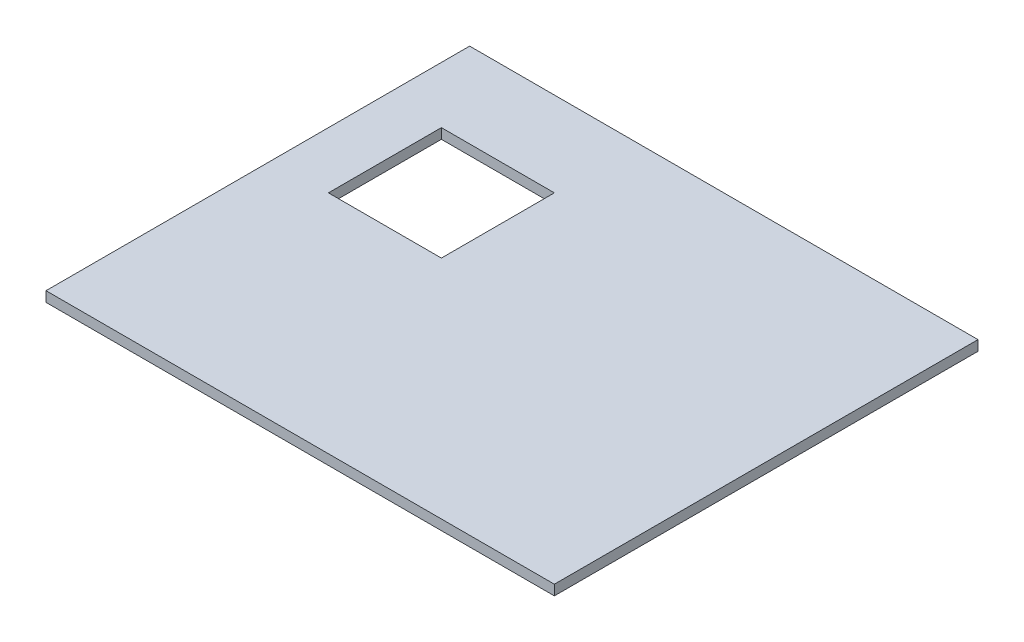
ISO-10303-21;
HEADER;
FILE_DESCRIPTION(('STEP AP214'),'2;1');
FILE_NAME('part.step','',(''),(''),'','','');
FILE_SCHEMA(('AUTOMOTIVE_DESIGN { 1 0 10303 214 1 1 1 1 }'));
ENDSEC;
DATA;
#1=APPLICATION_CONTEXT('core data for automotive mechanical design processes');
#2=APPLICATION_PROTOCOL_DEFINITION('international standard','automotive_design',2000,#1);
#3=PRODUCT_CONTEXT('',#1,'mechanical');
#4=PRODUCT('Part','Part','',(#3));
#5=PRODUCT_RELATED_PRODUCT_CATEGORY('part','',(#4));
#6=PRODUCT_DEFINITION_FORMATION('','',#4);
#7=PRODUCT_DEFINITION_CONTEXT('part definition',#1,'design');
#8=PRODUCT_DEFINITION('design','',#6,#7);
#9=PRODUCT_DEFINITION_SHAPE('','',#8);
#10=(LENGTH_UNIT() NAMED_UNIT(*) SI_UNIT(.MILLI.,.METRE.));
#11=(NAMED_UNIT(*) PLANE_ANGLE_UNIT() SI_UNIT($,.RADIAN.));
#12=(NAMED_UNIT(*) SI_UNIT($,.STERADIAN.) SOLID_ANGLE_UNIT());
#13=UNCERTAINTY_MEASURE_WITH_UNIT(LENGTH_MEASURE(1.E-05),#10,'distance_accuracy_value','');
#14=(GEOMETRIC_REPRESENTATION_CONTEXT(3) GLOBAL_UNCERTAINTY_ASSIGNED_CONTEXT((#13)) GLOBAL_UNIT_ASSIGNED_CONTEXT((#10,
#11,#12)) REPRESENTATION_CONTEXT('',''));
#15=CARTESIAN_POINT('',(0.,0.,0.));
#16=DIRECTION('',(0.,0.,1.));
#17=DIRECTION('',(1.,0.,0.));
#18=AXIS2_PLACEMENT_3D('',#15,#16,#17);
#19=CARTESIAN_POINT('',(0.,18.25625,0.));
#20=DIRECTION('',(0.,-1.,0.));
#21=DIRECTION('',(0.,0.,-1.));
#22=AXIS2_PLACEMENT_3D('',#19,#20,#21);
#23=PLANE('',#22);
#24=DIRECTION('',(0.,0.,-1.));
#25=VECTOR('',#24,1.);
#26=CARTESIAN_POINT('',(457.2,18.25625,381.));
#27=LINE('',#26,#25);
#28=CARTESIAN_POINT('',(457.2,18.25625,381.));
#29=VERTEX_POINT('',#28);
#30=CARTESIAN_POINT('',(457.2,18.25625,-381.));
#31=VERTEX_POINT('',#30);
#32=EDGE_CURVE('E137',#29,#31,#27,.T.);
#33=ORIENTED_EDGE('',*,*,#32,.T.);
#34=DIRECTION('',(-1.,0.,0.));
#35=VECTOR('',#34,1.);
#36=CARTESIAN_POINT('',(-457.2,18.25625,-381.));
#37=LINE('',#36,#35);
#38=CARTESIAN_POINT('',(-457.2,18.25625,-381.));
#39=VERTEX_POINT('',#38);
#40=EDGE_CURVE('E140',#31,#39,#37,.T.);
#41=ORIENTED_EDGE('',*,*,#40,.T.);
#42=DIRECTION('',(0.,0.,1.));
#43=VECTOR('',#42,1.);
#44=CARTESIAN_POINT('',(-457.2,18.25625,381.));
#45=LINE('',#44,#43);
#46=CARTESIAN_POINT('',(-457.2,18.25625,381.));
#47=VERTEX_POINT('',#46);
#48=EDGE_CURVE('E143',#39,#47,#45,.T.);
#49=ORIENTED_EDGE('',*,*,#48,.T.);
#50=DIRECTION('',(1.,0.,0.));
#51=VECTOR('',#50,1.);
#52=CARTESIAN_POINT('',(-457.2,18.25625,381.));
#53=LINE('',#52,#51);
#54=EDGE_CURVE('E145',#47,#29,#53,.T.);
#55=ORIENTED_EDGE('',*,*,#54,.T.);
#56=EDGE_LOOP('',(#33,#41,#49,#55));
#57=FACE_BOUND('',#56,.T.);
#58=DIRECTION('',(0.,0.,-1.));
#59=VECTOR('',#58,1.);
#60=CARTESIAN_POINT('',(-152.4,18.25625,-228.6));
#61=LINE('',#60,#59);
#62=CARTESIAN_POINT('',(-152.4,18.25625,-25.4));
#63=VERTEX_POINT('',#62);
#64=CARTESIAN_POINT('',(-152.4,18.25625,-228.6));
#65=VERTEX_POINT('',#64);
#66=EDGE_CURVE('E101',#63,#65,#61,.T.);
#67=ORIENTED_EDGE('',*,*,#66,.F.);
#68=DIRECTION('',(1.,0.,0.));
#69=VECTOR('',#68,1.);
#70=CARTESIAN_POINT('',(-355.6,18.25625,-25.4));
#71=LINE('',#70,#69);
#72=CARTESIAN_POINT('',(-355.6,18.25625,-25.4));
#73=VERTEX_POINT('',#72);
#74=EDGE_CURVE('E123',#73,#63,#71,.T.);
#75=ORIENTED_EDGE('',*,*,#74,.F.);
#76=DIRECTION('',(0.,0.,1.));
#77=VECTOR('',#76,1.);
#78=CARTESIAN_POINT('',(-355.6,18.25625,-228.6));
#79=LINE('',#78,#77);
#80=CARTESIAN_POINT('',(-355.6,18.25625,-228.6));
#81=VERTEX_POINT('',#80);
#82=EDGE_CURVE('E121',#81,#73,#79,.T.);
#83=ORIENTED_EDGE('',*,*,#82,.F.);
#84=DIRECTION('',(-1.,0.,0.));
#85=VECTOR('',#84,1.);
#86=CARTESIAN_POINT('',(-355.6,18.25625,-228.6));
#87=LINE('',#86,#85);
#88=EDGE_CURVE('E109',#65,#81,#87,.T.);
#89=ORIENTED_EDGE('',*,*,#88,.F.);
#90=EDGE_LOOP('',(#67,#75,#83,#89));
#91=FACE_BOUND('',#90,.T.);
#92=ADVANCED_FACE('F36',(#57,#91),#23,.F.);
#93=CARTESIAN_POINT('',(0.,0.,0.));
#94=DIRECTION('',(0.,-1.,0.));
#95=DIRECTION('',(0.,0.,-1.));
#96=AXIS2_PLACEMENT_3D('',#93,#94,#95);
#97=PLANE('',#96);
#98=DIRECTION('',(0.,0.,-1.));
#99=VECTOR('',#98,1.);
#100=CARTESIAN_POINT('',(457.2,0.,381.));
#101=LINE('',#100,#99);
#102=CARTESIAN_POINT('',(457.2,0.,381.));
#103=VERTEX_POINT('',#102);
#104=CARTESIAN_POINT('',(457.2,0.,-381.));
#105=VERTEX_POINT('',#104);
#106=EDGE_CURVE('E117',#103,#105,#101,.T.);
#107=ORIENTED_EDGE('',*,*,#106,.F.);
#108=DIRECTION('',(1.,0.,0.));
#109=VECTOR('',#108,1.);
#110=CARTESIAN_POINT('',(-457.2,0.,381.));
#111=LINE('',#110,#109);
#112=CARTESIAN_POINT('',(-457.2,0.,381.));
#113=VERTEX_POINT('',#112);
#114=EDGE_CURVE('E141',#113,#103,#111,.T.);
#115=ORIENTED_EDGE('',*,*,#114,.F.);
#116=DIRECTION('',(0.,0.,1.));
#117=VECTOR('',#116,1.);
#118=CARTESIAN_POINT('',(-457.2,0.,381.));
#119=LINE('',#118,#117);
#120=CARTESIAN_POINT('',(-457.2,0.,-381.));
#121=VERTEX_POINT('',#120);
#122=EDGE_CURVE('E152',#121,#113,#119,.T.);
#123=ORIENTED_EDGE('',*,*,#122,.F.);
#124=DIRECTION('',(-1.,0.,0.));
#125=VECTOR('',#124,1.);
#126=CARTESIAN_POINT('',(-457.2,0.,-381.));
#127=LINE('',#126,#125);
#128=EDGE_CURVE('E150',#105,#121,#127,.T.);
#129=ORIENTED_EDGE('',*,*,#128,.F.);
#130=EDGE_LOOP('',(#107,#115,#123,#129));
#131=FACE_BOUND('',#130,.T.);
#132=DIRECTION('',(1.,0.,0.));
#133=VECTOR('',#132,1.);
#134=CARTESIAN_POINT('',(-355.6,0.,-25.4));
#135=LINE('',#134,#133);
#136=CARTESIAN_POINT('',(-355.6,0.,-25.4));
#137=VERTEX_POINT('',#136);
#138=CARTESIAN_POINT('',(-152.4,0.,-25.4));
#139=VERTEX_POINT('',#138);
#140=EDGE_CURVE('E110',#137,#139,#135,.T.);
#141=ORIENTED_EDGE('',*,*,#140,.T.);
#142=DIRECTION('',(0.,0.,-1.));
#143=VECTOR('',#142,1.);
#144=CARTESIAN_POINT('',(-152.4,0.,-228.6));
#145=LINE('',#144,#143);
#146=CARTESIAN_POINT('',(-152.4,0.,-228.6));
#147=VERTEX_POINT('',#146);
#148=EDGE_CURVE('E59',#139,#147,#145,.T.);
#149=ORIENTED_EDGE('',*,*,#148,.T.);
#150=DIRECTION('',(-1.,0.,0.));
#151=VECTOR('',#150,1.);
#152=CARTESIAN_POINT('',(-355.6,0.,-228.6));
#153=LINE('',#152,#151);
#154=CARTESIAN_POINT('',(-355.6,0.,-228.6));
#155=VERTEX_POINT('',#154);
#156=EDGE_CURVE('E116',#147,#155,#153,.T.);
#157=ORIENTED_EDGE('',*,*,#156,.T.);
#158=DIRECTION('',(0.,0.,1.));
#159=VECTOR('',#158,1.);
#160=CARTESIAN_POINT('',(-355.6,0.,-228.6));
#161=LINE('',#160,#159);
#162=EDGE_CURVE('E129',#155,#137,#161,.T.);
#163=ORIENTED_EDGE('',*,*,#162,.T.);
#164=EDGE_LOOP('',(#141,#149,#157,#163));
#165=FACE_BOUND('',#164,.T.);
#166=ADVANCED_FACE('F170',(#131,#165),#97,.T.);
#167=CARTESIAN_POINT('',(457.2,18.25625,381.));
#168=DIRECTION('',(-1.,0.,0.));
#169=DIRECTION('',(0.,0.,1.));
#170=AXIS2_PLACEMENT_3D('',#167,#168,#169);
#171=PLANE('',#170);
#172=ORIENTED_EDGE('',*,*,#106,.T.);
#173=DIRECTION('',(0.,-1.,0.));
#174=VECTOR('',#173,1.);
#175=CARTESIAN_POINT('',(457.2,18.25625,-381.));
#176=LINE('',#175,#174);
#177=EDGE_CURVE('E11',#31,#105,#176,.T.);
#178=ORIENTED_EDGE('',*,*,#177,.F.);
#179=ORIENTED_EDGE('',*,*,#32,.F.);
#180=DIRECTION('',(0.,-1.,0.));
#181=VECTOR('',#180,1.);
#182=CARTESIAN_POINT('',(457.2,18.25625,381.));
#183=LINE('',#182,#181);
#184=EDGE_CURVE('E147',#29,#103,#183,.T.);
#185=ORIENTED_EDGE('',*,*,#184,.T.);
#186=EDGE_LOOP('',(#172,#178,#179,#185));
#187=FACE_BOUND('',#186,.T.);
#188=ADVANCED_FACE('F38',(#187),#171,.F.);
#189=CARTESIAN_POINT('',(-457.2,18.25625,-381.));
#190=DIRECTION('',(0.,0.,1.));
#191=DIRECTION('',(1.,0.,0.));
#192=AXIS2_PLACEMENT_3D('',#189,#190,#191);
#193=PLANE('',#192);
#194=ORIENTED_EDGE('',*,*,#128,.T.);
#195=DIRECTION('',(0.,-1.,0.));
#196=VECTOR('',#195,1.);
#197=CARTESIAN_POINT('',(-457.2,18.25625,-381.));
#198=LINE('',#197,#196);
#199=EDGE_CURVE('E44',#39,#121,#198,.T.);
#200=ORIENTED_EDGE('',*,*,#199,.F.);
#201=ORIENTED_EDGE('',*,*,#40,.F.);
#202=ORIENTED_EDGE('',*,*,#177,.T.);
#203=EDGE_LOOP('',(#194,#200,#201,#202));
#204=FACE_BOUND('',#203,.T.);
#205=ADVANCED_FACE('F180',(#204),#193,.F.);
#206=CARTESIAN_POINT('',(-457.2,18.25625,381.));
#207=DIRECTION('',(1.,0.,0.));
#208=DIRECTION('',(0.,0.,-1.));
#209=AXIS2_PLACEMENT_3D('',#206,#207,#208);
#210=PLANE('',#209);
#211=ORIENTED_EDGE('',*,*,#122,.T.);
#212=DIRECTION('',(0.,-1.,0.));
#213=VECTOR('',#212,1.);
#214=CARTESIAN_POINT('',(-457.2,18.25625,381.));
#215=LINE('',#214,#213);
#216=EDGE_CURVE('E157',#47,#113,#215,.T.);
#217=ORIENTED_EDGE('',*,*,#216,.F.);
#218=ORIENTED_EDGE('',*,*,#48,.F.);
#219=ORIENTED_EDGE('',*,*,#199,.T.);
#220=EDGE_LOOP('',(#211,#217,#218,#219));
#221=FACE_BOUND('',#220,.T.);
#222=ADVANCED_FACE('F164',(#221),#210,.F.);
#223=CARTESIAN_POINT('',(-457.2,18.25625,381.));
#224=DIRECTION('',(0.,0.,-1.));
#225=DIRECTION('',(-1.,0.,0.));
#226=AXIS2_PLACEMENT_3D('',#223,#224,#225);
#227=PLANE('',#226);
#228=ORIENTED_EDGE('',*,*,#114,.T.);
#229=ORIENTED_EDGE('',*,*,#184,.F.);
#230=ORIENTED_EDGE('',*,*,#54,.F.);
#231=ORIENTED_EDGE('',*,*,#216,.T.);
#232=EDGE_LOOP('',(#228,#229,#230,#231));
#233=FACE_BOUND('',#232,.T.);
#234=ADVANCED_FACE('F174',(#233),#227,.F.);
#235=CARTESIAN_POINT('',(-152.4,18.25625,-228.6));
#236=DIRECTION('',(-1.,0.,0.));
#237=DIRECTION('',(0.,0.,1.));
#238=AXIS2_PLACEMENT_3D('',#235,#236,#237);
#239=PLANE('',#238);
#240=ORIENTED_EDGE('',*,*,#148,.F.);
#241=DIRECTION('',(0.,-1.,0.));
#242=VECTOR('',#241,1.);
#243=CARTESIAN_POINT('',(-152.4,18.25625,-25.4));
#244=LINE('',#243,#242);
#245=EDGE_CURVE('E105',#63,#139,#244,.T.);
#246=ORIENTED_EDGE('',*,*,#245,.F.);
#247=ORIENTED_EDGE('',*,*,#66,.T.);
#248=DIRECTION('',(0.,-1.,0.));
#249=VECTOR('',#248,1.);
#250=CARTESIAN_POINT('',(-152.4,18.25625,-228.6));
#251=LINE('',#250,#249);
#252=EDGE_CURVE('E104',#65,#147,#251,.T.);
#253=ORIENTED_EDGE('',*,*,#252,.T.);
#254=EDGE_LOOP('',(#240,#246,#247,#253));
#255=FACE_BOUND('',#254,.T.);
#256=ADVANCED_FACE('F103',(#255),#239,.T.);
#257=CARTESIAN_POINT('',(-355.6,18.25625,-228.6));
#258=DIRECTION('',(0.,0.,1.));
#259=DIRECTION('',(1.,0.,0.));
#260=AXIS2_PLACEMENT_3D('',#257,#258,#259);
#261=PLANE('',#260);
#262=ORIENTED_EDGE('',*,*,#156,.F.);
#263=ORIENTED_EDGE('',*,*,#252,.F.);
#264=ORIENTED_EDGE('',*,*,#88,.T.);
#265=DIRECTION('',(0.,-1.,0.));
#266=VECTOR('',#265,1.);
#267=CARTESIAN_POINT('',(-355.6,18.25625,-228.6));
#268=LINE('',#267,#266);
#269=EDGE_CURVE('E118',#81,#155,#268,.T.);
#270=ORIENTED_EDGE('',*,*,#269,.T.);
#271=EDGE_LOOP('',(#262,#263,#264,#270));
#272=FACE_BOUND('',#271,.T.);
#273=ADVANCED_FACE('F113',(#272),#261,.T.);
#274=CARTESIAN_POINT('',(-355.6,18.25625,-228.6));
#275=DIRECTION('',(1.,0.,0.));
#276=DIRECTION('',(0.,0.,-1.));
#277=AXIS2_PLACEMENT_3D('',#274,#275,#276);
#278=PLANE('',#277);
#279=ORIENTED_EDGE('',*,*,#162,.F.);
#280=ORIENTED_EDGE('',*,*,#269,.F.);
#281=ORIENTED_EDGE('',*,*,#82,.T.);
#282=DIRECTION('',(0.,-1.,0.));
#283=VECTOR('',#282,1.);
#284=CARTESIAN_POINT('',(-355.6,18.25625,-25.4));
#285=LINE('',#284,#283);
#286=EDGE_CURVE('E51',#73,#137,#285,.T.);
#287=ORIENTED_EDGE('',*,*,#286,.T.);
#288=EDGE_LOOP('',(#279,#280,#281,#287));
#289=FACE_BOUND('',#288,.T.);
#290=ADVANCED_FACE('F203',(#289),#278,.T.);
#291=CARTESIAN_POINT('',(-355.6,18.25625,-25.4));
#292=DIRECTION('',(0.,0.,-1.));
#293=DIRECTION('',(-1.,0.,0.));
#294=AXIS2_PLACEMENT_3D('',#291,#292,#293);
#295=PLANE('',#294);
#296=ORIENTED_EDGE('',*,*,#140,.F.);
#297=ORIENTED_EDGE('',*,*,#286,.F.);
#298=ORIENTED_EDGE('',*,*,#74,.T.);
#299=ORIENTED_EDGE('',*,*,#245,.T.);
#300=EDGE_LOOP('',(#296,#297,#298,#299));
#301=FACE_BOUND('',#300,.T.);
#302=ADVANCED_FACE('F207',(#301),#295,.T.);
#303=CLOSED_SHELL('',(#92,#166,#188,#205,#222,#234,#256,#273,#290,#302));
#304=MANIFOLD_SOLID_BREP('B2',#303);
#305=ADVANCED_BREP_SHAPE_REPRESENTATION('',(#18,#304),#14);
#306=SHAPE_DEFINITION_REPRESENTATION(#9,#305);
ENDSEC;
END-ISO-10303-21;
